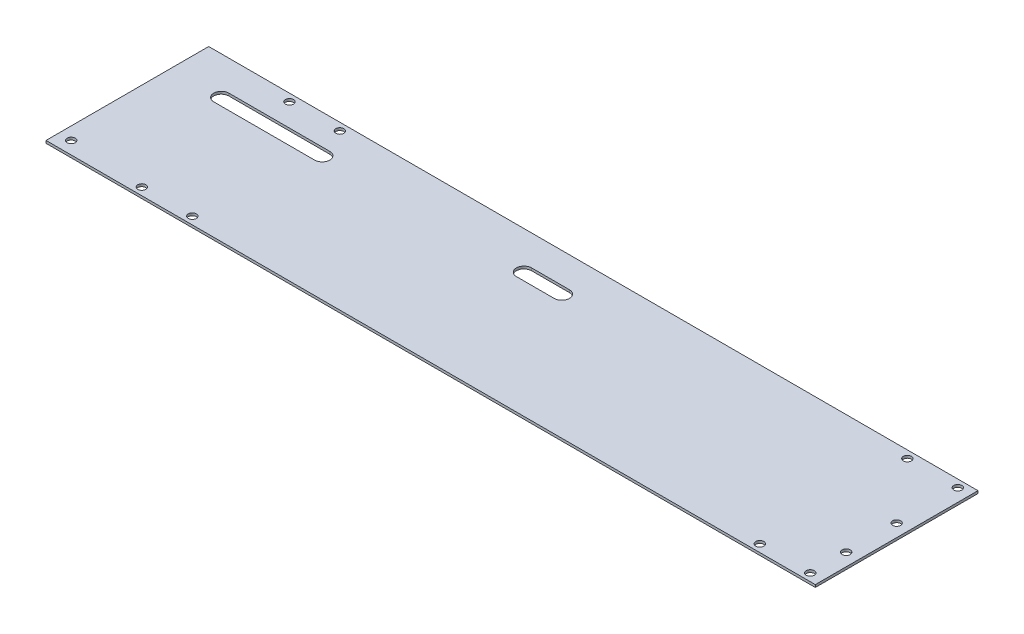
ISO-10303-21;
HEADER;
FILE_DESCRIPTION(('STEP AP214'),'2;1');
FILE_NAME('part.step','',(''),(''),'','','');
FILE_SCHEMA(('AUTOMOTIVE_DESIGN { 1 0 10303 214 1 1 1 1 }'));
ENDSEC;
DATA;
#1=APPLICATION_CONTEXT('core data for automotive mechanical design processes');
#2=APPLICATION_PROTOCOL_DEFINITION('international standard','automotive_design',2000,#1);
#3=PRODUCT_CONTEXT('',#1,'mechanical');
#4=PRODUCT('Part','Part','',(#3));
#5=PRODUCT_RELATED_PRODUCT_CATEGORY('part','',(#4));
#6=PRODUCT_DEFINITION_FORMATION('','',#4);
#7=PRODUCT_DEFINITION_CONTEXT('part definition',#1,'design');
#8=PRODUCT_DEFINITION('design','',#6,#7);
#9=PRODUCT_DEFINITION_SHAPE('','',#8);
#10=(LENGTH_UNIT() NAMED_UNIT(*) SI_UNIT(.MILLI.,.METRE.));
#11=(NAMED_UNIT(*) PLANE_ANGLE_UNIT() SI_UNIT($,.RADIAN.));
#12=(NAMED_UNIT(*) SI_UNIT($,.STERADIAN.) SOLID_ANGLE_UNIT());
#13=UNCERTAINTY_MEASURE_WITH_UNIT(LENGTH_MEASURE(1.E-05),#10,'distance_accuracy_value','');
#14=(GEOMETRIC_REPRESENTATION_CONTEXT(3) GLOBAL_UNCERTAINTY_ASSIGNED_CONTEXT((#13)) GLOBAL_UNIT_ASSIGNED_CONTEXT((#10,
#11,#12)) REPRESENTATION_CONTEXT('',''));
#15=CARTESIAN_POINT('',(0.,0.,0.));
#16=DIRECTION('',(0.,0.,1.));
#17=DIRECTION('',(1.,0.,0.));
#18=AXIS2_PLACEMENT_3D('',#15,#16,#17);
#19=CARTESIAN_POINT('',(0.,1.,0.));
#20=DIRECTION('',(1.,0.,0.));
#21=DIRECTION('',(0.,0.,-1.));
#22=AXIS2_PLACEMENT_3D('',#19,#20,#21);
#23=PLANE('',#22);
#24=DIRECTION('',(0.,0.,1.));
#25=VECTOR('',#24,1.);
#26=CARTESIAN_POINT('',(0.,0.,0.));
#27=LINE('',#26,#25);
#28=CARTESIAN_POINT('',(0.,0.,-64.5));
#29=VERTEX_POINT('',#28);
#30=CARTESIAN_POINT('',(0.,0.,0.));
#31=VERTEX_POINT('',#30);
#32=EDGE_CURVE('E264',#29,#31,#27,.T.);
#33=ORIENTED_EDGE('',*,*,#32,.T.);
#34=DIRECTION('',(0.,-1.,0.));
#35=VECTOR('',#34,1.);
#36=CARTESIAN_POINT('',(0.,1.,0.));
#37=LINE('',#36,#35);
#38=CARTESIAN_POINT('',(0.,1.,0.));
#39=VERTEX_POINT('',#38);
#40=EDGE_CURVE('E11',#39,#31,#37,.T.);
#41=ORIENTED_EDGE('',*,*,#40,.F.);
#42=DIRECTION('',(0.,0.,1.));
#43=VECTOR('',#42,1.);
#44=CARTESIAN_POINT('',(0.,1.,0.));
#45=LINE('',#44,#43);
#46=CARTESIAN_POINT('',(0.,1.,-64.5));
#47=VERTEX_POINT('',#46);
#48=EDGE_CURVE('E267',#47,#39,#45,.T.);
#49=ORIENTED_EDGE('',*,*,#48,.F.);
#50=DIRECTION('',(0.,-1.,0.));
#51=VECTOR('',#50,1.);
#52=CARTESIAN_POINT('',(0.,1.,-64.5));
#53=LINE('',#52,#51);
#54=EDGE_CURVE('E40',#47,#29,#53,.T.);
#55=ORIENTED_EDGE('',*,*,#54,.T.);
#56=EDGE_LOOP('',(#33,#41,#49,#55));
#57=FACE_BOUND('',#56,.T.);
#58=ADVANCED_FACE('F33',(#57),#23,.F.);
#59=CARTESIAN_POINT('',(0.,1.,0.));
#60=DIRECTION('',(0.,0.,-1.));
#61=DIRECTION('',(-1.,0.,0.));
#62=AXIS2_PLACEMENT_3D('',#59,#60,#61);
#63=PLANE('',#62);
#64=DIRECTION('',(1.,0.,0.));
#65=VECTOR('',#64,1.);
#66=CARTESIAN_POINT('',(0.,0.,0.));
#67=LINE('',#66,#65);
#68=CARTESIAN_POINT('',(305.,0.,0.));
#69=VERTEX_POINT('',#68);
#70=EDGE_CURVE('E278',#31,#69,#67,.T.);
#71=ORIENTED_EDGE('',*,*,#70,.T.);
#72=DIRECTION('',(0.,1.,0.));
#73=VECTOR('',#72,1.);
#74=CARTESIAN_POINT('',(305.,-0.000999999999999916,0.));
#75=LINE('',#74,#73);
#76=CARTESIAN_POINT('',(305.,1.,0.));
#77=VERTEX_POINT('',#76);
#78=EDGE_CURVE('E196',#69,#77,#75,.T.);
#79=ORIENTED_EDGE('',*,*,#78,.T.);
#80=DIRECTION('',(1.,0.,0.));
#81=VECTOR('',#80,1.);
#82=CARTESIAN_POINT('',(0.,1.,0.));
#83=LINE('',#82,#81);
#84=EDGE_CURVE('E270',#39,#77,#83,.T.);
#85=ORIENTED_EDGE('',*,*,#84,.F.);
#86=ORIENTED_EDGE('',*,*,#40,.T.);
#87=EDGE_LOOP('',(#71,#79,#85,#86));
#88=FACE_BOUND('',#87,.T.);
#89=ADVANCED_FACE('F293',(#88),#63,.F.);
#90=CARTESIAN_POINT('',(0.,1.,-64.5));
#91=DIRECTION('',(0.,0.,1.));
#92=DIRECTION('',(1.,0.,0.));
#93=AXIS2_PLACEMENT_3D('',#90,#91,#92);
#94=PLANE('',#93);
#95=DIRECTION('',(-1.,0.,0.));
#96=VECTOR('',#95,1.);
#97=CARTESIAN_POINT('',(0.,1.,-64.5));
#98=LINE('',#97,#96);
#99=CARTESIAN_POINT('',(305.,1.,-64.5));
#100=VERTEX_POINT('',#99);
#101=EDGE_CURVE('E274',#100,#47,#98,.T.);
#102=ORIENTED_EDGE('',*,*,#101,.F.);
#103=DIRECTION('',(0.,1.,0.));
#104=VECTOR('',#103,1.);
#105=CARTESIAN_POINT('',(305.,-0.000999999999999916,-64.5));
#106=LINE('',#105,#104);
#107=CARTESIAN_POINT('',(305.,0.,-64.5));
#108=VERTEX_POINT('',#107);
#109=EDGE_CURVE('E195',#108,#100,#106,.T.);
#110=ORIENTED_EDGE('',*,*,#109,.F.);
#111=DIRECTION('',(-1.,0.,0.));
#112=VECTOR('',#111,1.);
#113=CARTESIAN_POINT('',(0.,0.,-64.5));
#114=LINE('',#113,#112);
#115=EDGE_CURVE('E271',#108,#29,#114,.T.);
#116=ORIENTED_EDGE('',*,*,#115,.T.);
#117=ORIENTED_EDGE('',*,*,#54,.F.);
#118=EDGE_LOOP('',(#102,#110,#116,#117));
#119=FACE_BOUND('',#118,.T.);
#120=ADVANCED_FACE('F298',(#119),#94,.F.);
#121=CARTESIAN_POINT('',(0.,1.,0.));
#122=DIRECTION('',(0.,-1.,0.));
#123=DIRECTION('',(0.,0.,-1.));
#124=AXIS2_PLACEMENT_3D('',#121,#122,#123);
#125=PLANE('',#124);
#126=DIRECTION('',(1.,0.,0.));
#127=VECTOR('',#126,1.);
#128=CARTESIAN_POINT('',(140.,1.,-46.5));
#129=LINE('',#128,#127);
#130=CARTESIAN_POINT('',(140.,1.,-46.5));
#131=VERTEX_POINT('',#130);
#132=CARTESIAN_POINT('',(155.,1.,-46.5));
#133=VERTEX_POINT('',#132);
#134=EDGE_CURVE('E145',#131,#133,#129,.T.);
#135=ORIENTED_EDGE('',*,*,#134,.F.);
#136=CARTESIAN_POINT('',(140.,1.,-49.5));
#137=DIRECTION('',(0.,1.,0.));
#138=DIRECTION('',(0.,0.,1.));
#139=AXIS2_PLACEMENT_3D('',#136,#137,#138);
#140=CIRCLE('',#139,3.);
#141=CARTESIAN_POINT('',(140.,1.,-52.5));
#142=VERTEX_POINT('',#141);
#143=EDGE_CURVE('E47',#142,#131,#140,.T.);
#144=ORIENTED_EDGE('',*,*,#143,.F.);
#145=DIRECTION('',(-1.,0.,0.));
#146=VECTOR('',#145,1.);
#147=CARTESIAN_POINT('',(140.,1.,-52.5));
#148=LINE('',#147,#146);
#149=CARTESIAN_POINT('',(155.,1.,-52.5));
#150=VERTEX_POINT('',#149);
#151=EDGE_CURVE('E138',#150,#142,#148,.T.);
#152=ORIENTED_EDGE('',*,*,#151,.F.);
#153=CARTESIAN_POINT('',(155.,1.,-49.5));
#154=DIRECTION('',(0.,1.,0.));
#155=DIRECTION('',(0.,0.,1.));
#156=AXIS2_PLACEMENT_3D('',#153,#154,#155);
#157=CIRCLE('',#156,3.);
#158=EDGE_CURVE('E152',#133,#150,#157,.T.);
#159=ORIENTED_EDGE('',*,*,#158,.F.);
#160=EDGE_LOOP('',(#135,#144,#152,#159));
#161=FACE_BOUND('',#160,.T.);
#162=DIRECTION('',(1.,0.,0.));
#163=VECTOR('',#162,1.);
#164=CARTESIAN_POINT('',(20.,1.,-46.5));
#165=LINE('',#164,#163);
#166=CARTESIAN_POINT('',(20.,1.,-46.5));
#167=VERTEX_POINT('',#166);
#168=CARTESIAN_POINT('',(60.,1.,-46.5));
#169=VERTEX_POINT('',#168);
#170=EDGE_CURVE('E171',#167,#169,#165,.T.);
#171=ORIENTED_EDGE('',*,*,#170,.F.);
#172=CARTESIAN_POINT('',(20.,1.,-49.5));
#173=DIRECTION('',(0.,1.,0.));
#174=DIRECTION('',(0.,0.,1.));
#175=AXIS2_PLACEMENT_3D('',#172,#173,#174);
#176=CIRCLE('',#175,3.);
#177=CARTESIAN_POINT('',(20.,1.,-52.5));
#178=VERTEX_POINT('',#177);
#179=EDGE_CURVE('E55',#178,#167,#176,.T.);
#180=ORIENTED_EDGE('',*,*,#179,.F.);
#181=DIRECTION('',(-1.,0.,0.));
#182=VECTOR('',#181,1.);
#183=CARTESIAN_POINT('',(20.,1.,-52.5));
#184=LINE('',#183,#182);
#185=CARTESIAN_POINT('',(60.,1.,-52.5));
#186=VERTEX_POINT('',#185);
#187=EDGE_CURVE('E177',#186,#178,#184,.T.);
#188=ORIENTED_EDGE('',*,*,#187,.F.);
#189=CARTESIAN_POINT('',(60.,1.,-49.5));
#190=DIRECTION('',(0.,1.,0.));
#191=DIRECTION('',(0.,0.,1.));
#192=AXIS2_PLACEMENT_3D('',#189,#190,#191);
#193=CIRCLE('',#192,3.);
#194=EDGE_CURVE('E174',#169,#186,#193,.T.);
#195=ORIENTED_EDGE('',*,*,#194,.F.);
#196=EDGE_LOOP('',(#171,#180,#188,#195));
#197=FACE_BOUND('',#196,.T.);
#198=CARTESIAN_POINT('',(280.,1.,-3.));
#199=DIRECTION('',(0.,1.,0.));
#200=DIRECTION('',(0.,0.,-1.));
#201=AXIS2_PLACEMENT_3D('',#198,#199,#200);
#202=CIRCLE('',#201,1.60000000000002);
#203=CARTESIAN_POINT('',(280.,1.,-4.60000000000003));
#204=VERTEX_POINT('',#203);
#205=EDGE_CURVE('E229',#204,#204,#202,.T.);
#206=ORIENTED_EDGE('',*,*,#205,.F.);
#207=EDGE_LOOP('',(#206));
#208=FACE_BOUND('',#207,.T.);
#209=CARTESIAN_POINT('',(55.,1.,-3.));
#210=DIRECTION('',(0.,1.,0.));
#211=DIRECTION('',(0.,0.,-1.));
#212=AXIS2_PLACEMENT_3D('',#209,#210,#211);
#213=CIRCLE('',#212,1.59999999999996);
#214=CARTESIAN_POINT('',(55.,1.,-4.59999999999997));
#215=VERTEX_POINT('',#214);
#216=EDGE_CURVE('E216',#215,#215,#213,.T.);
#217=ORIENTED_EDGE('',*,*,#216,.F.);
#218=EDGE_LOOP('',(#217));
#219=FACE_BOUND('',#218,.T.);
#220=CARTESIAN_POINT('',(35.,1.,-3.));
#221=DIRECTION('',(0.,1.,0.));
#222=DIRECTION('',(0.,0.,-1.));
#223=AXIS2_PLACEMENT_3D('',#220,#221,#222);
#224=CIRCLE('',#223,1.59999999999996);
#225=CARTESIAN_POINT('',(35.,1.,-4.59999999999997));
#226=VERTEX_POINT('',#225);
#227=EDGE_CURVE('E217',#226,#226,#224,.T.);
#228=ORIENTED_EDGE('',*,*,#227,.F.);
#229=EDGE_LOOP('',(#228));
#230=FACE_BOUND('',#229,.T.);
#231=CARTESIAN_POINT('',(300.,1.,-37.25));
#232=DIRECTION('',(0.,1.,0.));
#233=DIRECTION('',(0.,0.,-1.));
#234=AXIS2_PLACEMENT_3D('',#231,#232,#233);
#235=CIRCLE('',#234,1.59999999999996);
#236=CARTESIAN_POINT('',(300.,1.,-38.85));
#237=VERTEX_POINT('',#236);
#238=EDGE_CURVE('E204',#237,#237,#235,.T.);
#239=ORIENTED_EDGE('',*,*,#238,.F.);
#240=EDGE_LOOP('',(#239));
#241=FACE_BOUND('',#240,.T.);
#242=CARTESIAN_POINT('',(300.,1.,-3.));
#243=DIRECTION('',(0.,1.,0.));
#244=DIRECTION('',(0.,0.,-1.));
#245=AXIS2_PLACEMENT_3D('',#242,#243,#244);
#246=CIRCLE('',#245,1.59999999999996);
#247=CARTESIAN_POINT('',(300.,1.,-4.59999999999997));
#248=VERTEX_POINT('',#247);
#249=EDGE_CURVE('E228',#248,#248,#246,.T.);
#250=ORIENTED_EDGE('',*,*,#249,.F.);
#251=EDGE_LOOP('',(#250));
#252=FACE_BOUND('',#251,.T.);
#253=CARTESIAN_POINT('',(300.,1.,-61.5));
#254=DIRECTION('',(0.,1.,0.));
#255=DIRECTION('',(0.,0.,1.));
#256=AXIS2_PLACEMENT_3D('',#253,#254,#255);
#257=CIRCLE('',#256,1.59999999999996);
#258=CARTESIAN_POINT('',(300.,1.,-59.9));
#259=VERTEX_POINT('',#258);
#260=EDGE_CURVE('E253',#259,#259,#257,.T.);
#261=ORIENTED_EDGE('',*,*,#260,.F.);
#262=EDGE_LOOP('',(#261));
#263=FACE_BOUND('',#262,.T.);
#264=CARTESIAN_POINT('',(280.,1.,-61.5));
#265=DIRECTION('',(0.,1.,0.));
#266=DIRECTION('',(0.,0.,1.));
#267=AXIS2_PLACEMENT_3D('',#264,#265,#266);
#268=CIRCLE('',#267,1.60000000000002);
#269=CARTESIAN_POINT('',(280.,1.,-59.9));
#270=VERTEX_POINT('',#269);
#271=EDGE_CURVE('E247',#270,#270,#268,.T.);
#272=ORIENTED_EDGE('',*,*,#271,.F.);
#273=EDGE_LOOP('',(#272));
#274=FACE_BOUND('',#273,.T.);
#275=CARTESIAN_POINT('',(55.,1.,-61.5));
#276=DIRECTION('',(0.,1.,0.));
#277=DIRECTION('',(0.,0.,1.));
#278=AXIS2_PLACEMENT_3D('',#275,#276,#277);
#279=CIRCLE('',#278,1.59999999999996);
#280=CARTESIAN_POINT('',(55.,1.,-59.9));
#281=VERTEX_POINT('',#280);
#282=EDGE_CURVE('E241',#281,#281,#279,.T.);
#283=ORIENTED_EDGE('',*,*,#282,.F.);
#284=EDGE_LOOP('',(#283));
#285=FACE_BOUND('',#284,.T.);
#286=CARTESIAN_POINT('',(300.,1.,-17.25));
#287=DIRECTION('',(0.,1.,0.));
#288=DIRECTION('',(0.,0.,-1.));
#289=AXIS2_PLACEMENT_3D('',#286,#287,#288);
#290=CIRCLE('',#289,1.60000000000002);
#291=CARTESIAN_POINT('',(300.,1.,-18.85));
#292=VERTEX_POINT('',#291);
#293=EDGE_CURVE('E205',#292,#292,#290,.T.);
#294=ORIENTED_EDGE('',*,*,#293,.F.);
#295=EDGE_LOOP('',(#294));
#296=FACE_BOUND('',#295,.T.);
#297=CARTESIAN_POINT('',(5.00000000000001,1.,-5.));
#298=DIRECTION('',(0.,1.,0.));
#299=DIRECTION('',(0.,0.,1.));
#300=AXIS2_PLACEMENT_3D('',#297,#298,#299);
#301=CIRCLE('',#300,1.6);
#302=CARTESIAN_POINT('',(5.00000000000001,1.,-3.4));
#303=VERTEX_POINT('',#302);
#304=EDGE_CURVE('E199',#303,#303,#301,.T.);
#305=ORIENTED_EDGE('',*,*,#304,.F.);
#306=EDGE_LOOP('',(#305));
#307=FACE_BOUND('',#306,.T.);
#308=CARTESIAN_POINT('',(35.,1.,-61.5));
#309=DIRECTION('',(0.,1.,0.));
#310=DIRECTION('',(0.,0.,1.));
#311=AXIS2_PLACEMENT_3D('',#308,#309,#310);
#312=CIRCLE('',#311,1.59999999999996);
#313=CARTESIAN_POINT('',(35.,1.,-59.9));
#314=VERTEX_POINT('',#313);
#315=EDGE_CURVE('E240',#314,#314,#312,.T.);
#316=ORIENTED_EDGE('',*,*,#315,.F.);
#317=EDGE_LOOP('',(#316));
#318=FACE_BOUND('',#317,.T.);
#319=ORIENTED_EDGE('',*,*,#84,.T.);
#320=DIRECTION('',(0.,0.,1.));
#321=VECTOR('',#320,1.);
#322=CARTESIAN_POINT('',(305.,1.,-64.5));
#323=LINE('',#322,#321);
#324=EDGE_CURVE('E193',#100,#77,#323,.T.);
#325=ORIENTED_EDGE('',*,*,#324,.F.);
#326=ORIENTED_EDGE('',*,*,#101,.T.);
#327=ORIENTED_EDGE('',*,*,#48,.T.);
#328=EDGE_LOOP('',(#319,#325,#326,#327));
#329=FACE_BOUND('',#328,.T.);
#330=ADVANCED_FACE('F296',(#161,#197,#208,#219,#230,#241,#252,#263,#274,#285,#296,#307,#318,
#329),#125,.F.);
#331=CARTESIAN_POINT('',(0.,0.,0.));
#332=DIRECTION('',(0.,-1.,0.));
#333=DIRECTION('',(0.,0.,-1.));
#334=AXIS2_PLACEMENT_3D('',#331,#332,#333);
#335=PLANE('',#334);
#336=CARTESIAN_POINT('',(140.,0.,-49.5));
#337=DIRECTION('',(0.,-1.,0.));
#338=DIRECTION('',(0.,0.,-1.));
#339=AXIS2_PLACEMENT_3D('',#336,#337,#338);
#340=CIRCLE('',#339,3.);
#341=CARTESIAN_POINT('',(140.,0.,-52.5));
#342=VERTEX_POINT('',#341);
#343=CARTESIAN_POINT('',(140.,0.,-46.5));
#344=VERTEX_POINT('',#343);
#345=EDGE_CURVE('E136',#342,#344,#340,.F.);
#346=ORIENTED_EDGE('',*,*,#345,.T.);
#347=DIRECTION('',(1.,0.,0.));
#348=VECTOR('',#347,1.);
#349=CARTESIAN_POINT('',(140.,0.,-46.5));
#350=LINE('',#349,#348);
#351=CARTESIAN_POINT('',(155.,0.,-46.5));
#352=VERTEX_POINT('',#351);
#353=EDGE_CURVE('E122',#344,#352,#350,.T.);
#354=ORIENTED_EDGE('',*,*,#353,.T.);
#355=CARTESIAN_POINT('',(155.,0.,-49.5));
#356=DIRECTION('',(0.,-1.,0.));
#357=DIRECTION('',(0.,0.,-1.));
#358=AXIS2_PLACEMENT_3D('',#355,#356,#357);
#359=CIRCLE('',#358,3.);
#360=CARTESIAN_POINT('',(155.,0.,-52.5));
#361=VERTEX_POINT('',#360);
#362=EDGE_CURVE('E147',#352,#361,#359,.F.);
#363=ORIENTED_EDGE('',*,*,#362,.T.);
#364=DIRECTION('',(-1.,0.,0.));
#365=VECTOR('',#364,1.);
#366=CARTESIAN_POINT('',(140.,0.,-52.5));
#367=LINE('',#366,#365);
#368=EDGE_CURVE('E143',#361,#342,#367,.T.);
#369=ORIENTED_EDGE('',*,*,#368,.T.);
#370=EDGE_LOOP('',(#346,#354,#363,#369));
#371=FACE_BOUND('',#370,.T.);
#372=CARTESIAN_POINT('',(20.,0.,-49.5));
#373=DIRECTION('',(0.,-1.,0.));
#374=DIRECTION('',(0.,0.,-1.));
#375=AXIS2_PLACEMENT_3D('',#372,#373,#374);
#376=CIRCLE('',#375,3.);
#377=CARTESIAN_POINT('',(20.,0.,-52.5));
#378=VERTEX_POINT('',#377);
#379=CARTESIAN_POINT('',(20.,0.,-46.5));
#380=VERTEX_POINT('',#379);
#381=EDGE_CURVE('E167',#378,#380,#376,.F.);
#382=ORIENTED_EDGE('',*,*,#381,.T.);
#383=DIRECTION('',(1.,0.,0.));
#384=VECTOR('',#383,1.);
#385=CARTESIAN_POINT('',(20.,0.,-46.5));
#386=LINE('',#385,#384);
#387=CARTESIAN_POINT('',(60.,0.,-46.5));
#388=VERTEX_POINT('',#387);
#389=EDGE_CURVE('E183',#380,#388,#386,.T.);
#390=ORIENTED_EDGE('',*,*,#389,.T.);
#391=CARTESIAN_POINT('',(60.,0.,-49.5));
#392=DIRECTION('',(0.,-1.,0.));
#393=DIRECTION('',(0.,0.,-1.));
#394=AXIS2_PLACEMENT_3D('',#391,#392,#393);
#395=CIRCLE('',#394,3.);
#396=CARTESIAN_POINT('',(60.,0.,-52.5));
#397=VERTEX_POINT('',#396);
#398=EDGE_CURVE('E161',#388,#397,#395,.F.);
#399=ORIENTED_EDGE('',*,*,#398,.T.);
#400=DIRECTION('',(-1.,0.,0.));
#401=VECTOR('',#400,1.);
#402=CARTESIAN_POINT('',(20.,0.,-52.5));
#403=LINE('',#402,#401);
#404=EDGE_CURVE('E164',#397,#378,#403,.T.);
#405=ORIENTED_EDGE('',*,*,#404,.T.);
#406=EDGE_LOOP('',(#382,#390,#399,#405));
#407=FACE_BOUND('',#406,.T.);
#408=DIRECTION('',(0.,0.,1.));
#409=VECTOR('',#408,1.);
#410=CARTESIAN_POINT('',(305.,0.,-64.5));
#411=LINE('',#410,#409);
#412=EDGE_CURVE('E132',#108,#69,#411,.T.);
#413=ORIENTED_EDGE('',*,*,#412,.T.);
#414=ORIENTED_EDGE('',*,*,#70,.F.);
#415=ORIENTED_EDGE('',*,*,#32,.F.);
#416=ORIENTED_EDGE('',*,*,#115,.F.);
#417=EDGE_LOOP('',(#413,#414,#415,#416));
#418=FACE_BOUND('',#417,.T.);
#419=CARTESIAN_POINT('',(280.,0.,-3.));
#420=DIRECTION('',(0.,1.,0.));
#421=DIRECTION('',(0.,0.,-1.));
#422=AXIS2_PLACEMENT_3D('',#419,#420,#421);
#423=CIRCLE('',#422,1.60000000000002);
#424=CARTESIAN_POINT('',(280.,0.,-4.60000000000003));
#425=VERTEX_POINT('',#424);
#426=EDGE_CURVE('E225',#425,#425,#423,.T.);
#427=ORIENTED_EDGE('',*,*,#426,.T.);
#428=EDGE_LOOP('',(#427));
#429=FACE_BOUND('',#428,.T.);
#430=CARTESIAN_POINT('',(55.,0.,-3.));
#431=DIRECTION('',(0.,1.,0.));
#432=DIRECTION('',(0.,0.,-1.));
#433=AXIS2_PLACEMENT_3D('',#430,#431,#432);
#434=CIRCLE('',#433,1.59999999999996);
#435=CARTESIAN_POINT('',(55.,0.,-4.59999999999997));
#436=VERTEX_POINT('',#435);
#437=EDGE_CURVE('E232',#436,#436,#434,.T.);
#438=ORIENTED_EDGE('',*,*,#437,.T.);
#439=EDGE_LOOP('',(#438));
#440=FACE_BOUND('',#439,.T.);
#441=CARTESIAN_POINT('',(35.,0.,-3.));
#442=DIRECTION('',(0.,1.,0.));
#443=DIRECTION('',(0.,0.,-1.));
#444=AXIS2_PLACEMENT_3D('',#441,#442,#443);
#445=CIRCLE('',#444,1.59999999999996);
#446=CARTESIAN_POINT('',(35.,0.,-4.59999999999997));
#447=VERTEX_POINT('',#446);
#448=EDGE_CURVE('E213',#447,#447,#445,.T.);
#449=ORIENTED_EDGE('',*,*,#448,.T.);
#450=EDGE_LOOP('',(#449));
#451=FACE_BOUND('',#450,.T.);
#452=CARTESIAN_POINT('',(300.,0.,-37.25));
#453=DIRECTION('',(0.,1.,0.));
#454=DIRECTION('',(0.,0.,-1.));
#455=AXIS2_PLACEMENT_3D('',#452,#453,#454);
#456=CIRCLE('',#455,1.59999999999996);
#457=CARTESIAN_POINT('',(300.,0.,-38.85));
#458=VERTEX_POINT('',#457);
#459=EDGE_CURVE('E220',#458,#458,#456,.T.);
#460=ORIENTED_EDGE('',*,*,#459,.T.);
#461=EDGE_LOOP('',(#460));
#462=FACE_BOUND('',#461,.T.);
#463=CARTESIAN_POINT('',(300.,0.,-3.));
#464=DIRECTION('',(0.,1.,0.));
#465=DIRECTION('',(0.,0.,-1.));
#466=AXIS2_PLACEMENT_3D('',#463,#464,#465);
#467=CIRCLE('',#466,1.59999999999996);
#468=CARTESIAN_POINT('',(300.,0.,-4.59999999999997));
#469=VERTEX_POINT('',#468);
#470=EDGE_CURVE('E256',#469,#469,#467,.T.);
#471=ORIENTED_EDGE('',*,*,#470,.T.);
#472=EDGE_LOOP('',(#471));
#473=FACE_BOUND('',#472,.T.);
#474=CARTESIAN_POINT('',(300.,0.,-61.5));
#475=DIRECTION('',(0.,1.,0.));
#476=DIRECTION('',(0.,0.,1.));
#477=AXIS2_PLACEMENT_3D('',#474,#475,#476);
#478=CIRCLE('',#477,1.59999999999996);
#479=CARTESIAN_POINT('',(300.,0.,-59.9));
#480=VERTEX_POINT('',#479);
#481=EDGE_CURVE('E250',#480,#480,#478,.T.);
#482=ORIENTED_EDGE('',*,*,#481,.T.);
#483=EDGE_LOOP('',(#482));
#484=FACE_BOUND('',#483,.T.);
#485=CARTESIAN_POINT('',(280.,0.,-61.5));
#486=DIRECTION('',(0.,1.,0.));
#487=DIRECTION('',(0.,0.,1.));
#488=AXIS2_PLACEMENT_3D('',#485,#486,#487);
#489=CIRCLE('',#488,1.60000000000002);
#490=CARTESIAN_POINT('',(280.,0.,-59.9));
#491=VERTEX_POINT('',#490);
#492=EDGE_CURVE('E244',#491,#491,#489,.T.);
#493=ORIENTED_EDGE('',*,*,#492,.T.);
#494=EDGE_LOOP('',(#493));
#495=FACE_BOUND('',#494,.T.);
#496=CARTESIAN_POINT('',(55.,0.,-61.5));
#497=DIRECTION('',(0.,1.,0.));
#498=DIRECTION('',(0.,0.,1.));
#499=AXIS2_PLACEMENT_3D('',#496,#497,#498);
#500=CIRCLE('',#499,1.59999999999996);
#501=CARTESIAN_POINT('',(55.,0.,-59.9));
#502=VERTEX_POINT('',#501);
#503=EDGE_CURVE('E237',#502,#502,#500,.T.);
#504=ORIENTED_EDGE('',*,*,#503,.T.);
#505=EDGE_LOOP('',(#504));
#506=FACE_BOUND('',#505,.T.);
#507=CARTESIAN_POINT('',(300.,0.,-17.25));
#508=DIRECTION('',(0.,1.,0.));
#509=DIRECTION('',(0.,0.,-1.));
#510=AXIS2_PLACEMENT_3D('',#507,#508,#509);
#511=CIRCLE('',#510,1.60000000000002);
#512=CARTESIAN_POINT('',(300.,0.,-18.85));
#513=VERTEX_POINT('',#512);
#514=EDGE_CURVE('E201',#513,#513,#511,.T.);
#515=ORIENTED_EDGE('',*,*,#514,.T.);
#516=EDGE_LOOP('',(#515));
#517=FACE_BOUND('',#516,.T.);
#518=CARTESIAN_POINT('',(5.00000000000001,0.,-5.));
#519=DIRECTION('',(0.,1.,0.));
#520=DIRECTION('',(0.,0.,1.));
#521=AXIS2_PLACEMENT_3D('',#518,#519,#520);
#522=CIRCLE('',#521,1.6);
#523=CARTESIAN_POINT('',(5.00000000000001,0.,-3.4));
#524=VERTEX_POINT('',#523);
#525=EDGE_CURVE('E208',#524,#524,#522,.T.);
#526=ORIENTED_EDGE('',*,*,#525,.T.);
#527=EDGE_LOOP('',(#526));
#528=FACE_BOUND('',#527,.T.);
#529=CARTESIAN_POINT('',(35.,0.,-61.5));
#530=DIRECTION('',(0.,1.,0.));
#531=DIRECTION('',(0.,0.,1.));
#532=AXIS2_PLACEMENT_3D('',#529,#530,#531);
#533=CIRCLE('',#532,1.59999999999996);
#534=CARTESIAN_POINT('',(35.,0.,-59.9));
#535=VERTEX_POINT('',#534);
#536=EDGE_CURVE('E261',#535,#535,#533,.T.);
#537=ORIENTED_EDGE('',*,*,#536,.T.);
#538=EDGE_LOOP('',(#537));
#539=FACE_BOUND('',#538,.T.);
#540=ADVANCED_FACE('F141',(#371,#407,#418,#429,#440,#451,#462,#473,#484,#495,#506,#517,#528,
#539),#335,.T.);
#541=CARTESIAN_POINT('',(35.,0.,-61.5));
#542=DIRECTION('',(0.,1.,0.));
#543=DIRECTION('',(0.,0.,1.));
#544=AXIS2_PLACEMENT_3D('',#541,#542,#543);
#545=CYLINDRICAL_SURFACE('',#544,1.59999999999996);
#546=ORIENTED_EDGE('',*,*,#536,.F.);
#547=EDGE_LOOP('',(#546));
#548=FACE_BOUND('',#547,.T.);
#549=ORIENTED_EDGE('',*,*,#315,.T.);
#550=EDGE_LOOP('',(#549));
#551=FACE_BOUND('',#550,.T.);
#552=ADVANCED_FACE('F326',(#548,#551),#545,.F.);
#553=CARTESIAN_POINT('',(5.00000000000001,0.,-5.));
#554=DIRECTION('',(0.,1.,0.));
#555=DIRECTION('',(0.,0.,1.));
#556=AXIS2_PLACEMENT_3D('',#553,#554,#555);
#557=CYLINDRICAL_SURFACE('',#556,1.6);
#558=ORIENTED_EDGE('',*,*,#525,.F.);
#559=EDGE_LOOP('',(#558));
#560=FACE_BOUND('',#559,.T.);
#561=ORIENTED_EDGE('',*,*,#304,.T.);
#562=EDGE_LOOP('',(#561));
#563=FACE_BOUND('',#562,.T.);
#564=ADVANCED_FACE('F332',(#560,#563),#557,.F.);
#565=CARTESIAN_POINT('',(300.,0.,-17.25));
#566=DIRECTION('',(0.,1.,0.));
#567=DIRECTION('',(0.,0.,1.));
#568=AXIS2_PLACEMENT_3D('',#565,#566,#567);
#569=CYLINDRICAL_SURFACE('',#568,1.60000000000002);
#570=ORIENTED_EDGE('',*,*,#514,.F.);
#571=EDGE_LOOP('',(#570));
#572=FACE_BOUND('',#571,.T.);
#573=ORIENTED_EDGE('',*,*,#293,.T.);
#574=EDGE_LOOP('',(#573));
#575=FACE_BOUND('',#574,.T.);
#576=ADVANCED_FACE('F350',(#572,#575),#569,.F.);
#577=CARTESIAN_POINT('',(55.,0.,-61.5));
#578=DIRECTION('',(0.,1.,0.));
#579=DIRECTION('',(0.,0.,1.));
#580=AXIS2_PLACEMENT_3D('',#577,#578,#579);
#581=CYLINDRICAL_SURFACE('',#580,1.59999999999996);
#582=ORIENTED_EDGE('',*,*,#503,.F.);
#583=EDGE_LOOP('',(#582));
#584=FACE_BOUND('',#583,.T.);
#585=ORIENTED_EDGE('',*,*,#282,.T.);
#586=EDGE_LOOP('',(#585));
#587=FACE_BOUND('',#586,.T.);
#588=ADVANCED_FACE('F346',(#584,#587),#581,.F.);
#589=CARTESIAN_POINT('',(280.,0.,-61.5));
#590=DIRECTION('',(0.,1.,0.));
#591=DIRECTION('',(0.,0.,1.));
#592=AXIS2_PLACEMENT_3D('',#589,#590,#591);
#593=CYLINDRICAL_SURFACE('',#592,1.60000000000002);
#594=ORIENTED_EDGE('',*,*,#492,.F.);
#595=EDGE_LOOP('',(#594));
#596=FACE_BOUND('',#595,.T.);
#597=ORIENTED_EDGE('',*,*,#271,.T.);
#598=EDGE_LOOP('',(#597));
#599=FACE_BOUND('',#598,.T.);
#600=ADVANCED_FACE('F342',(#596,#599),#593,.F.);
#601=CARTESIAN_POINT('',(300.,0.,-61.5));
#602=DIRECTION('',(0.,1.,0.));
#603=DIRECTION('',(0.,0.,1.));
#604=AXIS2_PLACEMENT_3D('',#601,#602,#603);
#605=CYLINDRICAL_SURFACE('',#604,1.59999999999996);
#606=ORIENTED_EDGE('',*,*,#481,.F.);
#607=EDGE_LOOP('',(#606));
#608=FACE_BOUND('',#607,.T.);
#609=ORIENTED_EDGE('',*,*,#260,.T.);
#610=EDGE_LOOP('',(#609));
#611=FACE_BOUND('',#610,.T.);
#612=ADVANCED_FACE('F338',(#608,#611),#605,.F.);
#613=CARTESIAN_POINT('',(300.,0.,-3.));
#614=DIRECTION('',(0.,1.,0.));
#615=DIRECTION('',(0.,0.,1.));
#616=AXIS2_PLACEMENT_3D('',#613,#614,#615);
#617=CYLINDRICAL_SURFACE('',#616,1.59999999999996);
#618=ORIENTED_EDGE('',*,*,#470,.F.);
#619=EDGE_LOOP('',(#618));
#620=FACE_BOUND('',#619,.T.);
#621=ORIENTED_EDGE('',*,*,#249,.T.);
#622=EDGE_LOOP('',(#621));
#623=FACE_BOUND('',#622,.T.);
#624=ADVANCED_FACE('F334',(#620,#623),#617,.F.);
#625=CARTESIAN_POINT('',(300.,0.,-37.25));
#626=DIRECTION('',(0.,1.,0.));
#627=DIRECTION('',(0.,0.,1.));
#628=AXIS2_PLACEMENT_3D('',#625,#626,#627);
#629=CYLINDRICAL_SURFACE('',#628,1.59999999999996);
#630=ORIENTED_EDGE('',*,*,#459,.F.);
#631=EDGE_LOOP('',(#630));
#632=FACE_BOUND('',#631,.T.);
#633=ORIENTED_EDGE('',*,*,#238,.T.);
#634=EDGE_LOOP('',(#633));
#635=FACE_BOUND('',#634,.T.);
#636=ADVANCED_FACE('F337',(#632,#635),#629,.F.);
#637=CARTESIAN_POINT('',(35.,0.,-3.));
#638=DIRECTION('',(0.,1.,0.));
#639=DIRECTION('',(0.,0.,1.));
#640=AXIS2_PLACEMENT_3D('',#637,#638,#639);
#641=CYLINDRICAL_SURFACE('',#640,1.59999999999996);
#642=ORIENTED_EDGE('',*,*,#448,.F.);
#643=EDGE_LOOP('',(#642));
#644=FACE_BOUND('',#643,.T.);
#645=ORIENTED_EDGE('',*,*,#227,.T.);
#646=EDGE_LOOP('',(#645));
#647=FACE_BOUND('',#646,.T.);
#648=ADVANCED_FACE('F353',(#644,#647),#641,.F.);
#649=CARTESIAN_POINT('',(55.,0.,-3.));
#650=DIRECTION('',(0.,1.,0.));
#651=DIRECTION('',(0.,0.,1.));
#652=AXIS2_PLACEMENT_3D('',#649,#650,#651);
#653=CYLINDRICAL_SURFACE('',#652,1.59999999999996);
#654=ORIENTED_EDGE('',*,*,#437,.F.);
#655=EDGE_LOOP('',(#654));
#656=FACE_BOUND('',#655,.T.);
#657=ORIENTED_EDGE('',*,*,#216,.T.);
#658=EDGE_LOOP('',(#657));
#659=FACE_BOUND('',#658,.T.);
#660=ADVANCED_FACE('F311',(#656,#659),#653,.F.);
#661=CARTESIAN_POINT('',(280.,0.,-3.));
#662=DIRECTION('',(0.,1.,0.));
#663=DIRECTION('',(0.,0.,1.));
#664=AXIS2_PLACEMENT_3D('',#661,#662,#663);
#665=CYLINDRICAL_SURFACE('',#664,1.60000000000002);
#666=ORIENTED_EDGE('',*,*,#426,.F.);
#667=EDGE_LOOP('',(#666));
#668=FACE_BOUND('',#667,.T.);
#669=ORIENTED_EDGE('',*,*,#205,.T.);
#670=EDGE_LOOP('',(#669));
#671=FACE_BOUND('',#670,.T.);
#672=ADVANCED_FACE('F303',(#668,#671),#665,.F.);
#673=CARTESIAN_POINT('',(305.,-0.000999999999999916,-64.5));
#674=DIRECTION('',(-1.,0.,0.));
#675=DIRECTION('',(0.,0.,1.));
#676=AXIS2_PLACEMENT_3D('',#673,#674,#675);
#677=PLANE('',#676);
#678=ORIENTED_EDGE('',*,*,#109,.T.);
#679=ORIENTED_EDGE('',*,*,#324,.T.);
#680=ORIENTED_EDGE('',*,*,#78,.F.);
#681=ORIENTED_EDGE('',*,*,#412,.F.);
#682=EDGE_LOOP('',(#678,#679,#680,#681));
#683=FACE_BOUND('',#682,.T.);
#684=ADVANCED_FACE('F300',(#683),#677,.F.);
#685=CARTESIAN_POINT('',(20.,-0.000999999999999916,-49.5));
#686=DIRECTION('',(0.,1.,0.));
#687=DIRECTION('',(0.,0.,1.));
#688=AXIS2_PLACEMENT_3D('',#685,#686,#687);
#689=CYLINDRICAL_SURFACE('',#688,3.);
#690=DIRECTION('',(0.,1.,0.));
#691=VECTOR('',#690,1.);
#692=CARTESIAN_POINT('',(20.,-0.000999999999999916,-52.5));
#693=LINE('',#692,#691);
#694=EDGE_CURVE('E181',#378,#178,#693,.T.);
#695=ORIENTED_EDGE('',*,*,#694,.T.);
#696=ORIENTED_EDGE('',*,*,#179,.T.);
#697=DIRECTION('',(0.,1.,0.));
#698=VECTOR('',#697,1.);
#699=CARTESIAN_POINT('',(20.,-0.000999999999999916,-46.5));
#700=LINE('',#699,#698);
#701=EDGE_CURVE('E180',#380,#167,#700,.T.);
#702=ORIENTED_EDGE('',*,*,#701,.F.);
#703=ORIENTED_EDGE('',*,*,#381,.F.);
#704=EDGE_LOOP('',(#695,#696,#702,#703));
#705=FACE_BOUND('',#704,.T.);
#706=ADVANCED_FACE('F302',(#705),#689,.F.);
#707=CARTESIAN_POINT('',(20.,-0.000999999999999916,-52.5));
#708=DIRECTION('',(0.,0.,-1.));
#709=DIRECTION('',(-1.,0.,0.));
#710=AXIS2_PLACEMENT_3D('',#707,#708,#709);
#711=PLANE('',#710);
#712=DIRECTION('',(0.,1.,0.));
#713=VECTOR('',#712,1.);
#714=CARTESIAN_POINT('',(60.,-0.000999999999999916,-52.5));
#715=LINE('',#714,#713);
#716=EDGE_CURVE('E184',#397,#186,#715,.T.);
#717=ORIENTED_EDGE('',*,*,#716,.T.);
#718=ORIENTED_EDGE('',*,*,#187,.T.);
#719=ORIENTED_EDGE('',*,*,#694,.F.);
#720=ORIENTED_EDGE('',*,*,#404,.F.);
#721=EDGE_LOOP('',(#717,#718,#719,#720));
#722=FACE_BOUND('',#721,.T.);
#723=ADVANCED_FACE('F309',(#722),#711,.F.);
#724=CARTESIAN_POINT('',(60.,-0.000999999999999916,-49.5));
#725=DIRECTION('',(0.,1.,0.));
#726=DIRECTION('',(0.,0.,1.));
#727=AXIS2_PLACEMENT_3D('',#724,#725,#726);
#728=CYLINDRICAL_SURFACE('',#727,3.);
#729=DIRECTION('',(0.,1.,0.));
#730=VECTOR('',#729,1.);
#731=CARTESIAN_POINT('',(60.,-0.000999999999999916,-46.5));
#732=LINE('',#731,#730);
#733=EDGE_CURVE('E186',#388,#169,#732,.T.);
#734=ORIENTED_EDGE('',*,*,#733,.T.);
#735=ORIENTED_EDGE('',*,*,#194,.T.);
#736=ORIENTED_EDGE('',*,*,#716,.F.);
#737=ORIENTED_EDGE('',*,*,#398,.F.);
#738=EDGE_LOOP('',(#734,#735,#736,#737));
#739=FACE_BOUND('',#738,.T.);
#740=ADVANCED_FACE('F455',(#739),#728,.F.);
#741=CARTESIAN_POINT('',(20.,-0.000999999999999916,-46.5));
#742=DIRECTION('',(0.,0.,1.));
#743=DIRECTION('',(1.,0.,0.));
#744=AXIS2_PLACEMENT_3D('',#741,#742,#743);
#745=PLANE('',#744);
#746=ORIENTED_EDGE('',*,*,#701,.T.);
#747=ORIENTED_EDGE('',*,*,#170,.T.);
#748=ORIENTED_EDGE('',*,*,#733,.F.);
#749=ORIENTED_EDGE('',*,*,#389,.F.);
#750=EDGE_LOOP('',(#746,#747,#748,#749));
#751=FACE_BOUND('',#750,.T.);
#752=ADVANCED_FACE('F465',(#751),#745,.F.);
#753=CARTESIAN_POINT('',(140.,-0.000999999999999916,-49.5));
#754=DIRECTION('',(0.,1.,0.));
#755=DIRECTION('',(0.,0.,1.));
#756=AXIS2_PLACEMENT_3D('',#753,#754,#755);
#757=CYLINDRICAL_SURFACE('',#756,3.);
#758=DIRECTION('',(0.,1.,0.));
#759=VECTOR('',#758,1.);
#760=CARTESIAN_POINT('',(140.,-0.000999999999999916,-52.5));
#761=LINE('',#760,#759);
#762=EDGE_CURVE('E133',#342,#142,#761,.T.);
#763=ORIENTED_EDGE('',*,*,#762,.T.);
#764=ORIENTED_EDGE('',*,*,#143,.T.);
#765=DIRECTION('',(0.,1.,0.));
#766=VECTOR('',#765,1.);
#767=CARTESIAN_POINT('',(140.,-0.000999999999999916,-46.5));
#768=LINE('',#767,#766);
#769=EDGE_CURVE('E125',#344,#131,#768,.T.);
#770=ORIENTED_EDGE('',*,*,#769,.F.);
#771=ORIENTED_EDGE('',*,*,#345,.F.);
#772=EDGE_LOOP('',(#763,#764,#770,#771));
#773=FACE_BOUND('',#772,.T.);
#774=ADVANCED_FACE('F135',(#773),#757,.F.);
#775=CARTESIAN_POINT('',(140.,-0.000999999999999916,-52.5));
#776=DIRECTION('',(0.,0.,-1.));
#777=DIRECTION('',(-1.,0.,0.));
#778=AXIS2_PLACEMENT_3D('',#775,#776,#777);
#779=PLANE('',#778);
#780=DIRECTION('',(0.,1.,0.));
#781=VECTOR('',#780,1.);
#782=CARTESIAN_POINT('',(155.,-0.000999999999999916,-52.5));
#783=LINE('',#782,#781);
#784=EDGE_CURVE('E158',#361,#150,#783,.T.);
#785=ORIENTED_EDGE('',*,*,#784,.T.);
#786=ORIENTED_EDGE('',*,*,#151,.T.);
#787=ORIENTED_EDGE('',*,*,#762,.F.);
#788=ORIENTED_EDGE('',*,*,#368,.F.);
#789=EDGE_LOOP('',(#785,#786,#787,#788));
#790=FACE_BOUND('',#789,.T.);
#791=ADVANCED_FACE('F484',(#790),#779,.F.);
#792=CARTESIAN_POINT('',(155.,-0.000999999999999916,-49.5));
#793=DIRECTION('',(0.,1.,0.));
#794=DIRECTION('',(0.,0.,1.));
#795=AXIS2_PLACEMENT_3D('',#792,#793,#794);
#796=CYLINDRICAL_SURFACE('',#795,3.);
#797=DIRECTION('',(0.,1.,0.));
#798=VECTOR('',#797,1.);
#799=CARTESIAN_POINT('',(155.,-0.000999999999999916,-46.5));
#800=LINE('',#799,#798);
#801=EDGE_CURVE('E127',#352,#133,#800,.T.);
#802=ORIENTED_EDGE('',*,*,#801,.T.);
#803=ORIENTED_EDGE('',*,*,#158,.T.);
#804=ORIENTED_EDGE('',*,*,#784,.F.);
#805=ORIENTED_EDGE('',*,*,#362,.F.);
#806=EDGE_LOOP('',(#802,#803,#804,#805));
#807=FACE_BOUND('',#806,.T.);
#808=ADVANCED_FACE('F493',(#807),#796,.F.);
#809=CARTESIAN_POINT('',(140.,-0.000999999999999916,-46.5));
#810=DIRECTION('',(0.,0.,1.));
#811=DIRECTION('',(1.,0.,0.));
#812=AXIS2_PLACEMENT_3D('',#809,#810,#811);
#813=PLANE('',#812);
#814=ORIENTED_EDGE('',*,*,#769,.T.);
#815=ORIENTED_EDGE('',*,*,#134,.T.);
#816=ORIENTED_EDGE('',*,*,#801,.F.);
#817=ORIENTED_EDGE('',*,*,#353,.F.);
#818=EDGE_LOOP('',(#814,#815,#816,#817));
#819=FACE_BOUND('',#818,.T.);
#820=ADVANCED_FACE('F123',(#819),#813,.F.);
#821=CLOSED_SHELL('',(#58,#89,#120,#330,#540,#552,#564,#576,#588,#600,#612,#624,#636,#648,#660,
#672,#684,#706,#723,#740,#752,#774,#791,#808,#820));
#822=MANIFOLD_SOLID_BREP('B2',#821);
#823=ADVANCED_BREP_SHAPE_REPRESENTATION('',(#18,#822),#14);
#824=SHAPE_DEFINITION_REPRESENTATION(#9,#823);
ENDSEC;
END-ISO-10303-21;
